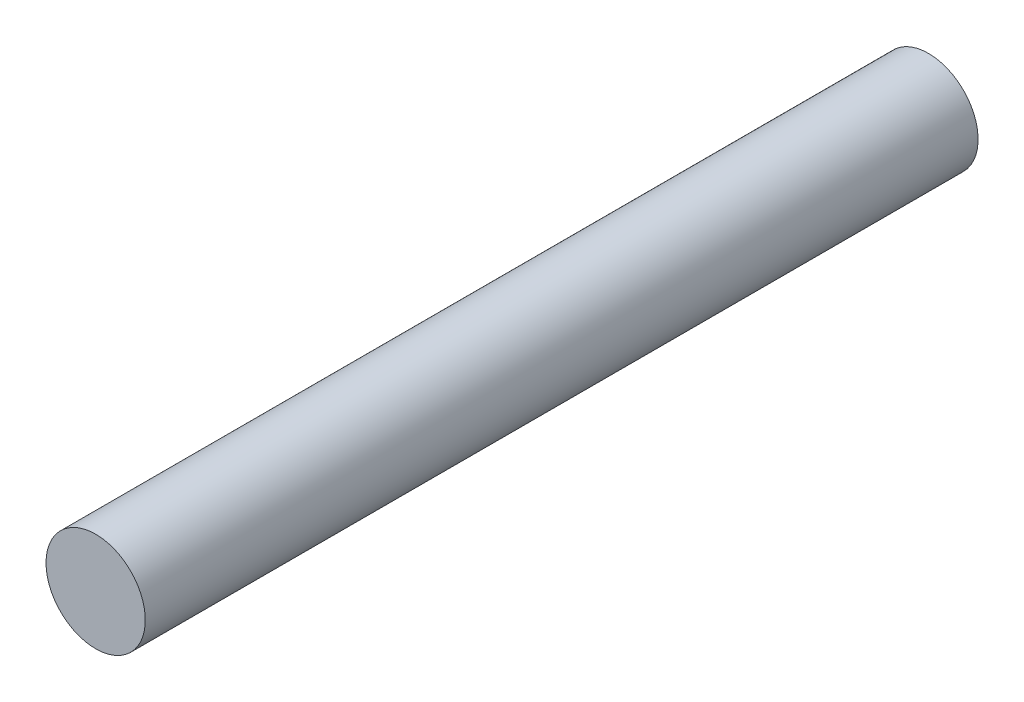
ISO-10303-21;
HEADER;
FILE_DESCRIPTION(('STEP AP214'),'2;1');
FILE_NAME('part.step','',(''),(''),'','','');
FILE_SCHEMA(('AUTOMOTIVE_DESIGN { 1 0 10303 214 1 1 1 1 }'));
ENDSEC;
DATA;
#1=APPLICATION_CONTEXT('core data for automotive mechanical design processes');
#2=APPLICATION_PROTOCOL_DEFINITION('international standard','automotive_design',2000,#1);
#3=PRODUCT_CONTEXT('',#1,'mechanical');
#4=PRODUCT('Part','Part','',(#3));
#5=PRODUCT_RELATED_PRODUCT_CATEGORY('part','',(#4));
#6=PRODUCT_DEFINITION_FORMATION('','',#4);
#7=PRODUCT_DEFINITION_CONTEXT('part definition',#1,'design');
#8=PRODUCT_DEFINITION('design','',#6,#7);
#9=PRODUCT_DEFINITION_SHAPE('','',#8);
#10=(LENGTH_UNIT() NAMED_UNIT(*) SI_UNIT(.MILLI.,.METRE.));
#11=(NAMED_UNIT(*) PLANE_ANGLE_UNIT() SI_UNIT($,.RADIAN.));
#12=(NAMED_UNIT(*) SI_UNIT($,.STERADIAN.) SOLID_ANGLE_UNIT());
#13=UNCERTAINTY_MEASURE_WITH_UNIT(LENGTH_MEASURE(1.E-05),#10,'distance_accuracy_value','');
#14=(GEOMETRIC_REPRESENTATION_CONTEXT(3) GLOBAL_UNCERTAINTY_ASSIGNED_CONTEXT((#13)) GLOBAL_UNIT_ASSIGNED_CONTEXT((#10,
#11,#12)) REPRESENTATION_CONTEXT('',''));
#15=CARTESIAN_POINT('',(0.,0.,0.));
#16=DIRECTION('',(0.,0.,1.));
#17=DIRECTION('',(1.,0.,0.));
#18=AXIS2_PLACEMENT_3D('',#15,#16,#17);
#19=CARTESIAN_POINT('',(0.,0.,52.));
#20=DIRECTION('',(0.,0.,-1.));
#21=DIRECTION('',(-1.,0.,0.));
#22=AXIS2_PLACEMENT_3D('',#19,#20,#21);
#23=CYLINDRICAL_SURFACE('',#22,3.1);
#24=CARTESIAN_POINT('',(0.,0.,52.));
#25=DIRECTION('',(0.,0.,1.));
#26=DIRECTION('',(1.,0.,0.));
#27=AXIS2_PLACEMENT_3D('',#24,#25,#26);
#28=CIRCLE('',#27,3.1);
#29=CARTESIAN_POINT('',(-3.1,0.,52.));
#30=VERTEX_POINT('',#29);
#31=EDGE_CURVE('E10',#30,#30,#28,.T.);
#32=CARTESIAN_POINT('',(0.,0.,0.));
#33=DIRECTION('',(0.,0.,1.));
#34=DIRECTION('',(1.,0.,0.));
#35=AXIS2_PLACEMENT_3D('',#32,#33,#34);
#36=CIRCLE('',#35,3.1);
#37=CARTESIAN_POINT('',(-3.1,0.,0.));
#38=VERTEX_POINT('',#37);
#39=EDGE_CURVE('E40',#38,#38,#36,.T.);
#40=CARTESIAN_POINT('',(-3.1,0.,52.));
#41=CARTESIAN_POINT('',(-3.1,0.,51.4583333333333));
#42=CARTESIAN_POINT('',(-3.1,0.,50.9166666666667));
#43=CARTESIAN_POINT('',(-3.1,0.,49.8333333333333));
#44=CARTESIAN_POINT('',(-3.1,0.,49.2916666666667));
#45=CARTESIAN_POINT('',(-3.1,0.,48.2083333333333));
#46=CARTESIAN_POINT('',(-3.1,0.,47.6666666666667));
#47=CARTESIAN_POINT('',(-3.1,0.,46.5833333333333));
#48=CARTESIAN_POINT('',(-3.1,0.,46.0416666666667));
#49=CARTESIAN_POINT('',(-3.1,0.,44.9583333333333));
#50=CARTESIAN_POINT('',(-3.1,0.,44.4166666666667));
#51=CARTESIAN_POINT('',(-3.1,0.,43.3333333333333));
#52=CARTESIAN_POINT('',(-3.1,0.,42.7916666666667));
#53=CARTESIAN_POINT('',(-3.1,0.,41.7083333333333));
#54=CARTESIAN_POINT('',(-3.1,0.,41.1666666666667));
#55=CARTESIAN_POINT('',(-3.1,0.,40.0833333333333));
#56=CARTESIAN_POINT('',(-3.1,0.,39.5416666666667));
#57=CARTESIAN_POINT('',(-3.1,0.,38.4583333333333));
#58=CARTESIAN_POINT('',(-3.1,0.,37.9166666666667));
#59=CARTESIAN_POINT('',(-3.1,0.,36.8333333333333));
#60=CARTESIAN_POINT('',(-3.1,0.,36.2916666666667));
#61=CARTESIAN_POINT('',(-3.1,0.,35.2083333333333));
#62=CARTESIAN_POINT('',(-3.1,0.,34.6666666666667));
#63=CARTESIAN_POINT('',(-3.1,0.,33.5833333333333));
#64=CARTESIAN_POINT('',(-3.1,0.,33.0416666666667));
#65=CARTESIAN_POINT('',(-3.1,0.,31.9583333333333));
#66=CARTESIAN_POINT('',(-3.1,0.,31.4166666666667));
#67=CARTESIAN_POINT('',(-3.1,0.,30.3333333333333));
#68=CARTESIAN_POINT('',(-3.1,0.,29.7916666666667));
#69=CARTESIAN_POINT('',(-3.1,0.,28.7083333333333));
#70=CARTESIAN_POINT('',(-3.1,0.,28.1666666666667));
#71=CARTESIAN_POINT('',(-3.1,0.,27.0833333333333));
#72=CARTESIAN_POINT('',(-3.1,0.,26.5416666666667));
#73=CARTESIAN_POINT('',(-3.1,0.,25.4583333333333));
#74=CARTESIAN_POINT('',(-3.1,0.,24.9166666666667));
#75=CARTESIAN_POINT('',(-3.1,0.,23.8333333333333));
#76=CARTESIAN_POINT('',(-3.1,0.,23.2916666666667));
#77=CARTESIAN_POINT('',(-3.1,0.,22.2083333333333));
#78=CARTESIAN_POINT('',(-3.1,0.,21.6666666666667));
#79=CARTESIAN_POINT('',(-3.1,0.,20.5833333333333));
#80=CARTESIAN_POINT('',(-3.1,0.,20.0416666666667));
#81=CARTESIAN_POINT('',(-3.1,0.,18.9583333333333));
#82=CARTESIAN_POINT('',(-3.1,0.,18.4166666666667));
#83=CARTESIAN_POINT('',(-3.1,0.,17.3333333333333));
#84=CARTESIAN_POINT('',(-3.1,0.,16.7916666666667));
#85=CARTESIAN_POINT('',(-3.1,0.,15.7083333333333));
#86=CARTESIAN_POINT('',(-3.1,0.,15.1666666666667));
#87=CARTESIAN_POINT('',(-3.1,0.,14.0833333333333));
#88=CARTESIAN_POINT('',(-3.1,0.,13.5416666666667));
#89=CARTESIAN_POINT('',(-3.1,0.,12.4583333333333));
#90=CARTESIAN_POINT('',(-3.1,0.,11.9166666666667));
#91=CARTESIAN_POINT('',(-3.1,0.,10.8333333333333));
#92=CARTESIAN_POINT('',(-3.1,0.,10.2916666666667));
#93=CARTESIAN_POINT('',(-3.1,0.,9.20833333333333));
#94=CARTESIAN_POINT('',(-3.1,0.,8.66666666666667));
#95=CARTESIAN_POINT('',(-3.1,0.,7.58333333333333));
#96=CARTESIAN_POINT('',(-3.1,0.,7.04166666666667));
#97=CARTESIAN_POINT('',(-3.1,0.,5.95833333333333));
#98=CARTESIAN_POINT('',(-3.1,0.,5.41666666666667));
#99=CARTESIAN_POINT('',(-3.1,0.,4.33333333333333));
#100=CARTESIAN_POINT('',(-3.1,0.,3.79166666666667));
#101=CARTESIAN_POINT('',(-3.1,0.,2.70833333333334));
#102=CARTESIAN_POINT('',(-3.1,0.,2.16666666666667));
#103=CARTESIAN_POINT('',(-3.1,0.,1.08333333333333));
#104=CARTESIAN_POINT('',(-3.1,0.,0.541666666666667));
#105=CARTESIAN_POINT('',(-3.1,0.,0.));
#106=B_SPLINE_CURVE_WITH_KNOTS('',3,(#40,#41,#42,#43,#44,#45,#46,#47,#48,#49,#50,#51,#52,#53,
#54,#55,#56,#57,#58,#59,#60,#61,#62,#63,#64,#65,#66,#67,#68,#69,#70,#71,#72,#73,#74,#75,#76,#77,
#78,#79,#80,#81,#82,#83,#84,#85,#86,#87,#88,#89,#90,#91,#92,#93,#94,#95,#96,#97,#98,#99,#100,
#101,#102,#103,#104,#105),.UNSPECIFIED.,.F.,.F.,(4,2,2,2,2,2,2,2,2,2,2,2,2,2,2,2,2,2,2,2,2,2,2,
2,2,2,2,2,2,2,2,2,4),(0.,1.62499999999999,3.25,4.875,6.49999999999999,8.12499999999999,
9.74999999999999,11.375,13.,14.625,16.25,17.875,19.5,21.125,22.75,24.375,26.,27.625,29.25,
30.875,32.5,34.125,35.75,37.375,39.,40.625,42.25,43.875,45.5,47.125,48.75,50.375,52.),.UNSPECIFIED.);
#107=EDGE_CURVE('BSEAM37',#30,#38,#106,.T.);
#108=ORIENTED_EDGE('',*,*,#31,.F.);
#109=ORIENTED_EDGE('',*,*,#39,.T.);
#110=ORIENTED_EDGE('',*,*,#107,.T.);
#111=ORIENTED_EDGE('',*,*,#107,.F.);
#112=EDGE_LOOP('',(#108,#110,#109,#111));
#113=FACE_BOUND('',#112,.T.);
#114=ADVANCED_FACE('F37',(#113),#23,.T.);
#115=CARTESIAN_POINT('',(0.,0.,52.));
#116=DIRECTION('',(0.,0.,1.));
#117=DIRECTION('',(1.,0.,0.));
#118=AXIS2_PLACEMENT_3D('',#115,#116,#117);
#119=PLANE('',#118);
#120=ORIENTED_EDGE('',*,*,#31,.T.);
#121=EDGE_LOOP('',(#120));
#122=FACE_BOUND('',#121,.T.);
#123=ADVANCED_FACE('F54',(#122),#119,.T.);
#124=CARTESIAN_POINT('',(0.,0.,0.));
#125=DIRECTION('',(0.,0.,1.));
#126=DIRECTION('',(1.,0.,0.));
#127=AXIS2_PLACEMENT_3D('',#124,#125,#126);
#128=PLANE('',#127);
#129=ORIENTED_EDGE('',*,*,#39,.F.);
#130=EDGE_LOOP('',(#129));
#131=FACE_BOUND('',#130,.T.);
#132=ADVANCED_FACE('F52',(#131),#128,.F.);
#133=CLOSED_SHELL('',(#114,#123,#132));
#134=MANIFOLD_SOLID_BREP('B2',#133);
#135=ADVANCED_BREP_SHAPE_REPRESENTATION('',(#18,#134),#14);
#136=SHAPE_DEFINITION_REPRESENTATION(#9,#135);
ENDSEC;
END-ISO-10303-21;
